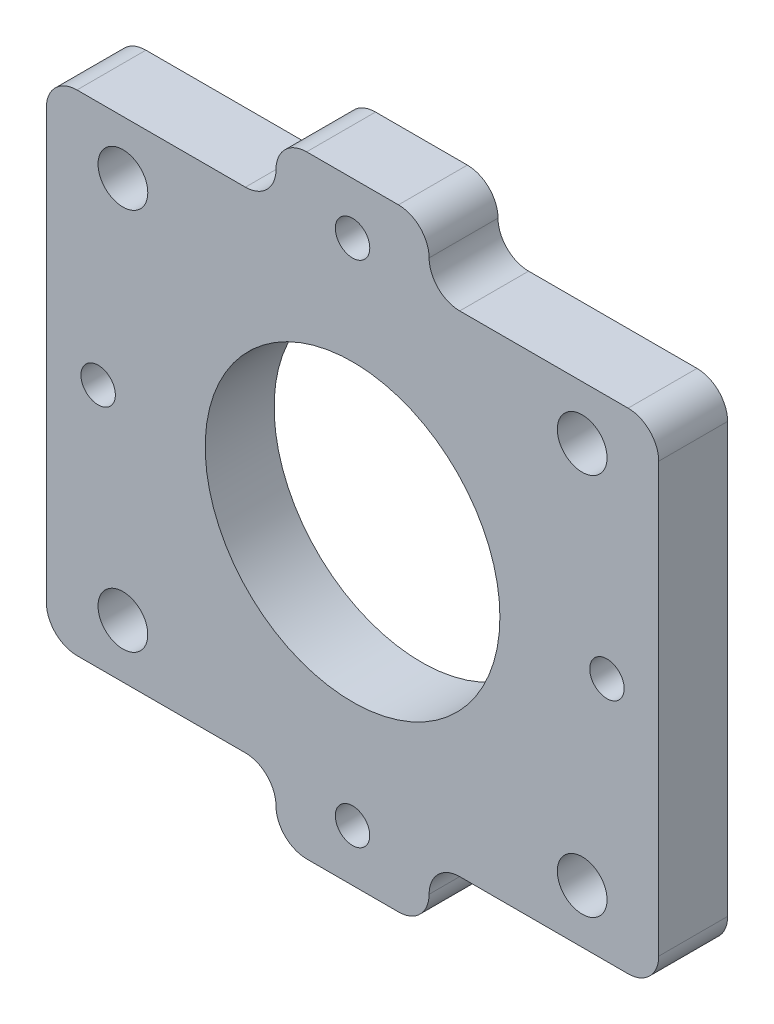
ISO-10303-21;
HEADER;
FILE_DESCRIPTION(('STEP AP214'),'2;1');
FILE_NAME('part.step','',(''),(''),'','','');
FILE_SCHEMA(('AUTOMOTIVE_DESIGN { 1 0 10303 214 1 1 1 1 }'));
ENDSEC;
DATA;
#1=APPLICATION_CONTEXT('core data for automotive mechanical design processes');
#2=APPLICATION_PROTOCOL_DEFINITION('international standard','automotive_design',2000,#1);
#3=PRODUCT_CONTEXT('',#1,'mechanical');
#4=PRODUCT('Part','Part','',(#3));
#5=PRODUCT_RELATED_PRODUCT_CATEGORY('part','',(#4));
#6=PRODUCT_DEFINITION_FORMATION('','',#4);
#7=PRODUCT_DEFINITION_CONTEXT('part definition',#1,'design');
#8=PRODUCT_DEFINITION('design','',#6,#7);
#9=PRODUCT_DEFINITION_SHAPE('','',#8);
#10=(LENGTH_UNIT() NAMED_UNIT(*) SI_UNIT(.MILLI.,.METRE.));
#11=(NAMED_UNIT(*) PLANE_ANGLE_UNIT() SI_UNIT($,.RADIAN.));
#12=(NAMED_UNIT(*) SI_UNIT($,.STERADIAN.) SOLID_ANGLE_UNIT());
#13=UNCERTAINTY_MEASURE_WITH_UNIT(LENGTH_MEASURE(1.E-05),#10,'distance_accuracy_value','');
#14=(GEOMETRIC_REPRESENTATION_CONTEXT(3) GLOBAL_UNCERTAINTY_ASSIGNED_CONTEXT((#13)) GLOBAL_UNIT_ASSIGNED_CONTEXT((#10,
#11,#12)) REPRESENTATION_CONTEXT('',''));
#15=CARTESIAN_POINT('',(0.,0.,0.));
#16=DIRECTION('',(0.,0.,1.));
#17=DIRECTION('',(1.,0.,0.));
#18=AXIS2_PLACEMENT_3D('',#15,#16,#17);
#19=CARTESIAN_POINT('',(0.,0.,9.));
#20=DIRECTION('',(1.,0.,0.));
#21=DIRECTION('',(0.,0.,-1.));
#22=AXIS2_PLACEMENT_3D('',#19,#20,#21);
#23=PLANE('',#22);
#24=DIRECTION('',(0.,-1.,0.));
#25=VECTOR('',#24,1.);
#26=CARTESIAN_POINT('',(0.,0.,0.));
#27=LINE('',#26,#25);
#28=CARTESIAN_POINT('',(0.,68.,0.));
#29=VERTEX_POINT('',#28);
#30=CARTESIAN_POINT('',(0.,12.,0.));
#31=VERTEX_POINT('',#30);
#32=EDGE_CURVE('E313',#29,#31,#27,.T.);
#33=ORIENTED_EDGE('',*,*,#32,.T.);
#34=DIRECTION('',(0.,0.,1.));
#35=VECTOR('',#34,1.);
#36=CARTESIAN_POINT('',(0.,12.,9.));
#37=LINE('',#36,#35);
#38=CARTESIAN_POINT('',(0.,12.,9.));
#39=VERTEX_POINT('',#38);
#40=EDGE_CURVE('E218',#31,#39,#37,.T.);
#41=ORIENTED_EDGE('',*,*,#40,.T.);
#42=DIRECTION('',(0.,-1.,0.));
#43=VECTOR('',#42,1.);
#44=CARTESIAN_POINT('',(0.,0.,9.));
#45=LINE('',#44,#43);
#46=CARTESIAN_POINT('',(0.,68.,9.));
#47=VERTEX_POINT('',#46);
#48=EDGE_CURVE('E303',#47,#39,#45,.T.);
#49=ORIENTED_EDGE('',*,*,#48,.F.);
#50=DIRECTION('',(0.,0.,1.));
#51=VECTOR('',#50,1.);
#52=CARTESIAN_POINT('',(0.,68.,9.));
#53=LINE('',#52,#51);
#54=EDGE_CURVE('E216',#47,#29,#53,.F.);
#55=ORIENTED_EDGE('',*,*,#54,.T.);
#56=EDGE_LOOP('',(#33,#41,#49,#55));
#57=FACE_BOUND('',#56,.T.);
#58=ADVANCED_FACE('F33',(#57),#23,.F.);
#59=CARTESIAN_POINT('',(0.,0.,9.));
#60=DIRECTION('',(0.,1.,0.));
#61=DIRECTION('',(0.,0.,1.));
#62=AXIS2_PLACEMENT_3D('',#59,#60,#61);
#63=PLANE('',#62);
#64=DIRECTION('',(1.,0.,0.));
#65=VECTOR('',#64,1.);
#66=CARTESIAN_POINT('',(0.,0.,9.));
#67=LINE('',#66,#65);
#68=CARTESIAN_POINT('',(34.,0.,9.));
#69=VERTEX_POINT('',#68);
#70=CARTESIAN_POINT('',(46.,0.,9.));
#71=VERTEX_POINT('',#70);
#72=EDGE_CURVE('E306',#69,#71,#67,.T.);
#73=ORIENTED_EDGE('',*,*,#72,.F.);
#74=DIRECTION('',(0.,0.,1.));
#75=VECTOR('',#74,1.);
#76=CARTESIAN_POINT('',(34.,0.,9.));
#77=LINE('',#76,#75);
#78=CARTESIAN_POINT('',(34.,0.,0.));
#79=VERTEX_POINT('',#78);
#80=EDGE_CURVE('E253',#69,#79,#77,.F.);
#81=ORIENTED_EDGE('',*,*,#80,.T.);
#82=DIRECTION('',(1.,0.,0.));
#83=VECTOR('',#82,1.);
#84=CARTESIAN_POINT('',(0.,0.,0.));
#85=LINE('',#84,#83);
#86=CARTESIAN_POINT('',(46.,0.,0.));
#87=VERTEX_POINT('',#86);
#88=EDGE_CURVE('E309',#79,#87,#85,.T.);
#89=ORIENTED_EDGE('',*,*,#88,.T.);
#90=DIRECTION('',(0.,0.,1.));
#91=VECTOR('',#90,1.);
#92=CARTESIAN_POINT('',(46.,0.,9.));
#93=LINE('',#92,#91);
#94=EDGE_CURVE('E251',#87,#71,#93,.T.);
#95=ORIENTED_EDGE('',*,*,#94,.T.);
#96=EDGE_LOOP('',(#73,#81,#89,#95));
#97=FACE_BOUND('',#96,.T.);
#98=ADVANCED_FACE('F414',(#97),#63,.F.);
#99=CARTESIAN_POINT('',(80.,0.,9.));
#100=DIRECTION('',(-1.,0.,0.));
#101=DIRECTION('',(0.,0.,1.));
#102=AXIS2_PLACEMENT_3D('',#99,#100,#101);
#103=PLANE('',#102);
#104=DIRECTION('',(0.,1.,0.));
#105=VECTOR('',#104,1.);
#106=CARTESIAN_POINT('',(80.,0.,9.));
#107=LINE('',#106,#105);
#108=CARTESIAN_POINT('',(80.,12.,9.));
#109=VERTEX_POINT('',#108);
#110=CARTESIAN_POINT('',(80.,68.,9.));
#111=VERTEX_POINT('',#110);
#112=EDGE_CURVE('E318',#109,#111,#107,.T.);
#113=ORIENTED_EDGE('',*,*,#112,.F.);
#114=DIRECTION('',(0.,0.,1.));
#115=VECTOR('',#114,1.);
#116=CARTESIAN_POINT('',(80.,12.,9.));
#117=LINE('',#116,#115);
#118=CARTESIAN_POINT('',(80.,12.,0.));
#119=VERTEX_POINT('',#118);
#120=EDGE_CURVE('E258',#109,#119,#117,.F.);
#121=ORIENTED_EDGE('',*,*,#120,.T.);
#122=DIRECTION('',(0.,1.,0.));
#123=VECTOR('',#122,1.);
#124=CARTESIAN_POINT('',(80.,0.,0.));
#125=LINE('',#124,#123);
#126=CARTESIAN_POINT('',(80.,68.,0.));
#127=VERTEX_POINT('',#126);
#128=EDGE_CURVE('E304',#119,#127,#125,.T.);
#129=ORIENTED_EDGE('',*,*,#128,.T.);
#130=DIRECTION('',(0.,0.,1.));
#131=VECTOR('',#130,1.);
#132=CARTESIAN_POINT('',(80.,68.,9.));
#133=LINE('',#132,#131);
#134=EDGE_CURVE('E255',#127,#111,#133,.T.);
#135=ORIENTED_EDGE('',*,*,#134,.T.);
#136=EDGE_LOOP('',(#113,#121,#129,#135));
#137=FACE_BOUND('',#136,.T.);
#138=ADVANCED_FACE('F435',(#137),#103,.F.);
#139=CARTESIAN_POINT('',(0.,80.,9.));
#140=DIRECTION('',(0.,-1.,0.));
#141=DIRECTION('',(0.,0.,-1.));
#142=AXIS2_PLACEMENT_3D('',#139,#140,#141);
#143=PLANE('',#142);
#144=DIRECTION('',(-1.,0.,0.));
#145=VECTOR('',#144,1.);
#146=CARTESIAN_POINT('',(0.,80.,9.));
#147=LINE('',#146,#145);
#148=CARTESIAN_POINT('',(46.,80.,9.));
#149=VERTEX_POINT('',#148);
#150=CARTESIAN_POINT('',(34.,80.,9.));
#151=VERTEX_POINT('',#150);
#152=EDGE_CURVE('E199',#149,#151,#147,.T.);
#153=ORIENTED_EDGE('',*,*,#152,.F.);
#154=DIRECTION('',(0.,0.,1.));
#155=VECTOR('',#154,1.);
#156=CARTESIAN_POINT('',(46.,80.,9.));
#157=LINE('',#156,#155);
#158=CARTESIAN_POINT('',(46.,80.,0.));
#159=VERTEX_POINT('',#158);
#160=EDGE_CURVE('E262',#149,#159,#157,.F.);
#161=ORIENTED_EDGE('',*,*,#160,.T.);
#162=DIRECTION('',(-1.,0.,0.));
#163=VECTOR('',#162,1.);
#164=CARTESIAN_POINT('',(0.,80.,0.));
#165=LINE('',#164,#163);
#166=CARTESIAN_POINT('',(34.,80.,0.));
#167=VERTEX_POINT('',#166);
#168=EDGE_CURVE('E295',#159,#167,#165,.T.);
#169=ORIENTED_EDGE('',*,*,#168,.T.);
#170=DIRECTION('',(0.,0.,1.));
#171=VECTOR('',#170,1.);
#172=CARTESIAN_POINT('',(34.,80.,9.));
#173=LINE('',#172,#171);
#174=EDGE_CURVE('E260',#167,#151,#173,.T.);
#175=ORIENTED_EDGE('',*,*,#174,.T.);
#176=EDGE_LOOP('',(#153,#161,#169,#175));
#177=FACE_BOUND('',#176,.T.);
#178=ADVANCED_FACE('F300',(#177),#143,.F.);
#179=CARTESIAN_POINT('',(0.,0.,9.));
#180=DIRECTION('',(0.,0.,-1.));
#181=DIRECTION('',(-1.,0.,0.));
#182=AXIS2_PLACEMENT_3D('',#179,#180,#181);
#183=PLANE('',#182);
#184=CARTESIAN_POINT('',(10.0000000000002,14.9999999999999,9.));
#185=DIRECTION('',(0.,0.,1.));
#186=DIRECTION('',(-1.,0.,0.));
#187=AXIS2_PLACEMENT_3D('',#184,#185,#186);
#188=CIRCLE('',#187,3.25);
#189=CARTESIAN_POINT('',(6.75000000000019,14.9999999999999,9.));
#190=VERTEX_POINT('',#189);
#191=EDGE_CURVE('E353',#190,#190,#188,.T.);
#192=ORIENTED_EDGE('',*,*,#191,.F.);
#193=EDGE_LOOP('',(#192));
#194=FACE_BOUND('',#193,.T.);
#195=CARTESIAN_POINT('',(70.0000000000002,15.0000000000003,9.));
#196=DIRECTION('',(0.,0.,1.));
#197=DIRECTION('',(1.,0.,0.));
#198=AXIS2_PLACEMENT_3D('',#195,#196,#197);
#199=CIRCLE('',#198,3.25000000000001);
#200=CARTESIAN_POINT('',(73.2500000000002,15.0000000000003,9.));
#201=VERTEX_POINT('',#200);
#202=EDGE_CURVE('E360',#201,#201,#199,.T.);
#203=ORIENTED_EDGE('',*,*,#202,.F.);
#204=EDGE_LOOP('',(#203));
#205=FACE_BOUND('',#204,.T.);
#206=CARTESIAN_POINT('',(70.,64.9999999999999,9.));
#207=DIRECTION('',(0.,0.,1.));
#208=DIRECTION('',(-1.,0.,0.));
#209=AXIS2_PLACEMENT_3D('',#206,#207,#208);
#210=CIRCLE('',#209,3.25000000000001);
#211=CARTESIAN_POINT('',(66.75,64.9999999999999,9.));
#212=VERTEX_POINT('',#211);
#213=EDGE_CURVE('E366',#212,#212,#210,.T.);
#214=ORIENTED_EDGE('',*,*,#213,.F.);
#215=EDGE_LOOP('',(#214));
#216=FACE_BOUND('',#215,.T.);
#217=CARTESIAN_POINT('',(10.,64.9999999999999,9.));
#218=DIRECTION('',(0.,0.,1.));
#219=DIRECTION('',(1.,0.,0.));
#220=AXIS2_PLACEMENT_3D('',#217,#218,#219);
#221=CIRCLE('',#220,3.25);
#222=CARTESIAN_POINT('',(13.25,64.9999999999999,9.));
#223=VERTEX_POINT('',#222);
#224=EDGE_CURVE('E372',#223,#223,#221,.T.);
#225=ORIENTED_EDGE('',*,*,#224,.F.);
#226=EDGE_LOOP('',(#225));
#227=FACE_BOUND('',#226,.T.);
#228=CARTESIAN_POINT('',(73.2340187157678,40.0000000000001,9.));
#229=DIRECTION('',(0.,0.,1.));
#230=DIRECTION('',(1.,0.,0.));
#231=AXIS2_PLACEMENT_3D('',#228,#229,#230);
#232=CIRCLE('',#231,2.25000000000018);
#233=CARTESIAN_POINT('',(75.4840187157679,40.0000000000001,9.));
#234=VERTEX_POINT('',#233);
#235=EDGE_CURVE('E336',#234,#234,#232,.T.);
#236=ORIENTED_EDGE('',*,*,#235,.F.);
#237=EDGE_LOOP('',(#236));
#238=FACE_BOUND('',#237,.T.);
#239=CARTESIAN_POINT('',(39.9999999999997,73.2340187157675,9.));
#240=DIRECTION('',(0.,0.,1.));
#241=DIRECTION('',(1.,0.,0.));
#242=AXIS2_PLACEMENT_3D('',#239,#240,#241);
#243=CIRCLE('',#242,2.25000000000017);
#244=CARTESIAN_POINT('',(42.2499999999999,73.2340187157675,9.));
#245=VERTEX_POINT('',#244);
#246=EDGE_CURVE('E329',#245,#245,#243,.T.);
#247=ORIENTED_EDGE('',*,*,#246,.F.);
#248=EDGE_LOOP('',(#247));
#249=FACE_BOUND('',#248,.T.);
#250=CARTESIAN_POINT('',(6.76598128423247,39.9999999999994,9.));
#251=DIRECTION('',(0.,0.,1.));
#252=DIRECTION('',(-1.,0.,0.));
#253=AXIS2_PLACEMENT_3D('',#250,#251,#252);
#254=CIRCLE('',#253,2.25);
#255=CARTESIAN_POINT('',(4.51598128423247,39.9999999999994,9.));
#256=VERTEX_POINT('',#255);
#257=EDGE_CURVE('E348',#256,#256,#254,.T.);
#258=ORIENTED_EDGE('',*,*,#257,.F.);
#259=EDGE_LOOP('',(#258));
#260=FACE_BOUND('',#259,.T.);
#261=CARTESIAN_POINT('',(40.0000000000005,6.76598128423199,9.));
#262=DIRECTION('',(0.,0.,1.));
#263=DIRECTION('',(-1.,0.,0.));
#264=AXIS2_PLACEMENT_3D('',#261,#262,#263);
#265=CIRCLE('',#264,2.25);
#266=CARTESIAN_POINT('',(37.7500000000005,6.76598128423199,9.));
#267=VERTEX_POINT('',#266);
#268=EDGE_CURVE('E341',#267,#267,#265,.T.);
#269=ORIENTED_EDGE('',*,*,#268,.F.);
#270=EDGE_LOOP('',(#269));
#271=FACE_BOUND('',#270,.T.);
#272=CARTESIAN_POINT('',(40.,40.,9.));
#273=DIRECTION('',(0.,0.,1.));
#274=DIRECTION('',(1.,0.,0.));
#275=AXIS2_PLACEMENT_3D('',#272,#273,#274);
#276=CIRCLE('',#275,19.25);
#277=CARTESIAN_POINT('',(59.25,40.,9.));
#278=VERTEX_POINT('',#277);
#279=EDGE_CURVE('E323',#278,#278,#276,.T.);
#280=ORIENTED_EDGE('',*,*,#279,.F.);
#281=EDGE_LOOP('',(#280));
#282=FACE_BOUND('',#281,.T.);
#283=ORIENTED_EDGE('',*,*,#48,.T.);
#284=CARTESIAN_POINT('',(4.,12.,9.));
#285=DIRECTION('',(0.,0.,-1.));
#286=DIRECTION('',(-1.,0.,0.));
#287=AXIS2_PLACEMENT_3D('',#284,#285,#286);
#288=CIRCLE('',#287,4.);
#289=CARTESIAN_POINT('',(4.,8.00000000000001,9.));
#290=VERTEX_POINT('',#289);
#291=EDGE_CURVE('E235',#39,#290,#288,.F.);
#292=ORIENTED_EDGE('',*,*,#291,.T.);
#293=DIRECTION('',(1.,0.,0.));
#294=VECTOR('',#293,1.);
#295=CARTESIAN_POINT('',(0.,8.00000000000001,9.));
#296=LINE('',#295,#294);
#297=CARTESIAN_POINT('',(26.,7.99999999999999,9.));
#298=VERTEX_POINT('',#297);
#299=EDGE_CURVE('E385',#290,#298,#296,.T.);
#300=ORIENTED_EDGE('',*,*,#299,.T.);
#301=CARTESIAN_POINT('',(26.,3.99999999999999,9.));
#302=DIRECTION('',(0.,0.,-1.));
#303=DIRECTION('',(-1.,0.,0.));
#304=AXIS2_PLACEMENT_3D('',#301,#302,#303);
#305=CIRCLE('',#304,4.);
#306=CARTESIAN_POINT('',(30.,4.00000000000001,9.));
#307=VERTEX_POINT('',#306);
#308=EDGE_CURVE('E180',#298,#307,#305,.T.);
#309=ORIENTED_EDGE('',*,*,#308,.T.);
#310=CARTESIAN_POINT('',(34.,4.,9.));
#311=DIRECTION('',(0.,0.,-1.));
#312=DIRECTION('',(-1.,0.,0.));
#313=AXIS2_PLACEMENT_3D('',#310,#311,#312);
#314=CIRCLE('',#313,4.);
#315=EDGE_CURVE('E233',#307,#69,#314,.F.);
#316=ORIENTED_EDGE('',*,*,#315,.T.);
#317=ORIENTED_EDGE('',*,*,#72,.T.);
#318=CARTESIAN_POINT('',(46.,4.,9.));
#319=DIRECTION('',(0.,0.,-1.));
#320=DIRECTION('',(-1.,0.,0.));
#321=AXIS2_PLACEMENT_3D('',#318,#319,#320);
#322=CIRCLE('',#321,4.);
#323=CARTESIAN_POINT('',(50.,4.,9.));
#324=VERTEX_POINT('',#323);
#325=EDGE_CURVE('E231',#71,#324,#322,.F.);
#326=ORIENTED_EDGE('',*,*,#325,.T.);
#327=CARTESIAN_POINT('',(54.,4.,9.));
#328=DIRECTION('',(0.,0.,-1.));
#329=DIRECTION('',(-1.,0.,0.));
#330=AXIS2_PLACEMENT_3D('',#327,#328,#329);
#331=CIRCLE('',#330,4.);
#332=CARTESIAN_POINT('',(54.,8.,9.));
#333=VERTEX_POINT('',#332);
#334=EDGE_CURVE('E179',#324,#333,#331,.T.);
#335=ORIENTED_EDGE('',*,*,#334,.T.);
#336=DIRECTION('',(1.,0.,0.));
#337=VECTOR('',#336,1.);
#338=CARTESIAN_POINT('',(0.,7.99999999999995,9.));
#339=LINE('',#338,#337);
#340=CARTESIAN_POINT('',(76.,8.00000000000001,9.));
#341=VERTEX_POINT('',#340);
#342=EDGE_CURVE('E387',#333,#341,#339,.T.);
#343=ORIENTED_EDGE('',*,*,#342,.T.);
#344=CARTESIAN_POINT('',(76.,12.,9.));
#345=DIRECTION('',(0.,0.,-1.));
#346=DIRECTION('',(-1.,0.,0.));
#347=AXIS2_PLACEMENT_3D('',#344,#345,#346);
#348=CIRCLE('',#347,4.);
#349=EDGE_CURVE('E229',#341,#109,#348,.F.);
#350=ORIENTED_EDGE('',*,*,#349,.T.);
#351=ORIENTED_EDGE('',*,*,#112,.T.);
#352=CARTESIAN_POINT('',(76.,68.,9.));
#353=DIRECTION('',(0.,0.,-1.));
#354=DIRECTION('',(-1.,0.,0.));
#355=AXIS2_PLACEMENT_3D('',#352,#353,#354);
#356=CIRCLE('',#355,4.);
#357=CARTESIAN_POINT('',(76.,72.,9.));
#358=VERTEX_POINT('',#357);
#359=EDGE_CURVE('E227',#111,#358,#356,.F.);
#360=ORIENTED_EDGE('',*,*,#359,.T.);
#361=DIRECTION('',(-1.,0.,0.));
#362=VECTOR('',#361,1.);
#363=CARTESIAN_POINT('',(0.,72.,9.));
#364=LINE('',#363,#362);
#365=CARTESIAN_POINT('',(54.,72.,9.));
#366=VERTEX_POINT('',#365);
#367=EDGE_CURVE('E357',#358,#366,#364,.T.);
#368=ORIENTED_EDGE('',*,*,#367,.T.);
#369=CARTESIAN_POINT('',(54.,76.,9.));
#370=DIRECTION('',(0.,0.,-1.));
#371=DIRECTION('',(-1.,0.,0.));
#372=AXIS2_PLACEMENT_3D('',#369,#370,#371);
#373=CIRCLE('',#372,4.);
#374=CARTESIAN_POINT('',(50.,76.,9.));
#375=VERTEX_POINT('',#374);
#376=EDGE_CURVE('E268',#366,#375,#373,.T.);
#377=ORIENTED_EDGE('',*,*,#376,.T.);
#378=CARTESIAN_POINT('',(46.,76.,9.));
#379=DIRECTION('',(0.,0.,-1.));
#380=DIRECTION('',(-1.,0.,0.));
#381=AXIS2_PLACEMENT_3D('',#378,#379,#380);
#382=CIRCLE('',#381,4.);
#383=EDGE_CURVE('E225',#375,#149,#382,.F.);
#384=ORIENTED_EDGE('',*,*,#383,.T.);
#385=ORIENTED_EDGE('',*,*,#152,.T.);
#386=CARTESIAN_POINT('',(34.,76.,9.));
#387=DIRECTION('',(0.,0.,-1.));
#388=DIRECTION('',(-1.,0.,0.));
#389=AXIS2_PLACEMENT_3D('',#386,#387,#388);
#390=CIRCLE('',#389,4.);
#391=CARTESIAN_POINT('',(30.,76.,9.));
#392=VERTEX_POINT('',#391);
#393=EDGE_CURVE('E223',#151,#392,#390,.F.);
#394=ORIENTED_EDGE('',*,*,#393,.T.);
#395=CARTESIAN_POINT('',(26.,76.,9.));
#396=DIRECTION('',(0.,0.,-1.));
#397=DIRECTION('',(-1.,0.,0.));
#398=AXIS2_PLACEMENT_3D('',#395,#396,#397);
#399=CIRCLE('',#398,4.);
#400=CARTESIAN_POINT('',(26.,72.,9.));
#401=VERTEX_POINT('',#400);
#402=EDGE_CURVE('E42',#392,#401,#399,.T.);
#403=ORIENTED_EDGE('',*,*,#402,.T.);
#404=DIRECTION('',(-1.,0.,0.));
#405=VECTOR('',#404,1.);
#406=CARTESIAN_POINT('',(0.,72.,9.));
#407=LINE('',#406,#405);
#408=CARTESIAN_POINT('',(4.,72.,9.));
#409=VERTEX_POINT('',#408);
#410=EDGE_CURVE('E382',#401,#409,#407,.T.);
#411=ORIENTED_EDGE('',*,*,#410,.T.);
#412=CARTESIAN_POINT('',(4.,68.,9.));
#413=DIRECTION('',(0.,0.,-1.));
#414=DIRECTION('',(-1.,0.,0.));
#415=AXIS2_PLACEMENT_3D('',#412,#413,#414);
#416=CIRCLE('',#415,4.);
#417=EDGE_CURVE('E221',#409,#47,#416,.F.);
#418=ORIENTED_EDGE('',*,*,#417,.T.);
#419=EDGE_LOOP('',(#283,#292,#300,#309,#316,#317,#326,#335,#343,#350,#351,#360,#368,#377,#384,
#385,#394,#403,#411,#418));
#420=FACE_BOUND('',#419,.T.);
#421=ADVANCED_FACE('F403',(#194,#205,#216,#227,#238,#249,#260,#271,#282,#420),#183,.F.);
#422=CARTESIAN_POINT('',(0.,0.,0.));
#423=DIRECTION('',(0.,0.,-1.));
#424=DIRECTION('',(-1.,0.,0.));
#425=AXIS2_PLACEMENT_3D('',#422,#423,#424);
#426=PLANE('',#425);
#427=DIRECTION('',(-1.,0.,0.));
#428=VECTOR('',#427,1.);
#429=CARTESIAN_POINT('',(30.,7.99999999999999,0.));
#430=LINE('',#429,#428);
#431=CARTESIAN_POINT('',(26.,7.99999999999999,0.));
#432=VERTEX_POINT('',#431);
#433=CARTESIAN_POINT('',(4.,8.00000000000001,0.));
#434=VERTEX_POINT('',#433);
#435=EDGE_CURVE('E174',#432,#434,#430,.T.);
#436=ORIENTED_EDGE('',*,*,#435,.T.);
#437=CARTESIAN_POINT('',(4.,12.,0.));
#438=DIRECTION('',(0.,0.,-1.));
#439=DIRECTION('',(-1.,0.,0.));
#440=AXIS2_PLACEMENT_3D('',#437,#438,#439);
#441=CIRCLE('',#440,4.);
#442=EDGE_CURVE('E249',#434,#31,#441,.T.);
#443=ORIENTED_EDGE('',*,*,#442,.T.);
#444=ORIENTED_EDGE('',*,*,#32,.F.);
#445=CARTESIAN_POINT('',(4.,68.,0.));
#446=DIRECTION('',(0.,0.,-1.));
#447=DIRECTION('',(-1.,0.,0.));
#448=AXIS2_PLACEMENT_3D('',#445,#446,#447);
#449=CIRCLE('',#448,4.);
#450=CARTESIAN_POINT('',(4.00000000000001,72.,0.));
#451=VERTEX_POINT('',#450);
#452=EDGE_CURVE('E237',#29,#451,#449,.T.);
#453=ORIENTED_EDGE('',*,*,#452,.T.);
#454=DIRECTION('',(1.,0.,0.));
#455=VECTOR('',#454,1.);
#456=CARTESIAN_POINT('',(30.,72.,0.));
#457=LINE('',#456,#455);
#458=CARTESIAN_POINT('',(26.,72.,0.));
#459=VERTEX_POINT('',#458);
#460=EDGE_CURVE('E190',#451,#459,#457,.T.);
#461=ORIENTED_EDGE('',*,*,#460,.T.);
#462=CARTESIAN_POINT('',(26.,76.,0.));
#463=DIRECTION('',(0.,0.,-1.));
#464=DIRECTION('',(-1.,0.,0.));
#465=AXIS2_PLACEMENT_3D('',#462,#463,#464);
#466=CIRCLE('',#465,4.);
#467=CARTESIAN_POINT('',(30.,76.,0.));
#468=VERTEX_POINT('',#467);
#469=EDGE_CURVE('E11',#459,#468,#466,.F.);
#470=ORIENTED_EDGE('',*,*,#469,.T.);
#471=CARTESIAN_POINT('',(34.,76.,0.));
#472=DIRECTION('',(0.,0.,-1.));
#473=DIRECTION('',(-1.,0.,0.));
#474=AXIS2_PLACEMENT_3D('',#471,#472,#473);
#475=CIRCLE('',#474,4.);
#476=EDGE_CURVE('E239',#468,#167,#475,.T.);
#477=ORIENTED_EDGE('',*,*,#476,.T.);
#478=ORIENTED_EDGE('',*,*,#168,.F.);
#479=CARTESIAN_POINT('',(46.,76.,0.));
#480=DIRECTION('',(0.,0.,-1.));
#481=DIRECTION('',(-1.,0.,0.));
#482=AXIS2_PLACEMENT_3D('',#479,#480,#481);
#483=CIRCLE('',#482,4.);
#484=CARTESIAN_POINT('',(50.,76.,0.));
#485=VERTEX_POINT('',#484);
#486=EDGE_CURVE('E241',#159,#485,#483,.T.);
#487=ORIENTED_EDGE('',*,*,#486,.T.);
#488=CARTESIAN_POINT('',(54.,76.,0.));
#489=DIRECTION('',(0.,0.,-1.));
#490=DIRECTION('',(-1.,0.,0.));
#491=AXIS2_PLACEMENT_3D('',#488,#489,#490);
#492=CIRCLE('',#491,4.);
#493=CARTESIAN_POINT('',(54.,72.,0.));
#494=VERTEX_POINT('',#493);
#495=EDGE_CURVE('E270',#485,#494,#492,.F.);
#496=ORIENTED_EDGE('',*,*,#495,.T.);
#497=DIRECTION('',(1.,0.,0.));
#498=VECTOR('',#497,1.);
#499=CARTESIAN_POINT('',(50.,72.,0.));
#500=LINE('',#499,#498);
#501=CARTESIAN_POINT('',(76.,72.,0.));
#502=VERTEX_POINT('',#501);
#503=EDGE_CURVE('E379',#494,#502,#500,.T.);
#504=ORIENTED_EDGE('',*,*,#503,.T.);
#505=CARTESIAN_POINT('',(76.,68.,0.));
#506=DIRECTION('',(0.,0.,-1.));
#507=DIRECTION('',(-1.,0.,0.));
#508=AXIS2_PLACEMENT_3D('',#505,#506,#507);
#509=CIRCLE('',#508,4.);
#510=EDGE_CURVE('E243',#502,#127,#509,.T.);
#511=ORIENTED_EDGE('',*,*,#510,.T.);
#512=ORIENTED_EDGE('',*,*,#128,.F.);
#513=CARTESIAN_POINT('',(76.,12.,0.));
#514=DIRECTION('',(0.,0.,-1.));
#515=DIRECTION('',(-1.,0.,0.));
#516=AXIS2_PLACEMENT_3D('',#513,#514,#515);
#517=CIRCLE('',#516,4.);
#518=CARTESIAN_POINT('',(76.,8.00000000000001,0.));
#519=VERTEX_POINT('',#518);
#520=EDGE_CURVE('E245',#119,#519,#517,.T.);
#521=ORIENTED_EDGE('',*,*,#520,.T.);
#522=DIRECTION('',(-1.,0.,0.));
#523=VECTOR('',#522,1.);
#524=CARTESIAN_POINT('',(50.,7.99999999999999,0.));
#525=LINE('',#524,#523);
#526=CARTESIAN_POINT('',(54.,8.,0.));
#527=VERTEX_POINT('',#526);
#528=EDGE_CURVE('E191',#519,#527,#525,.T.);
#529=ORIENTED_EDGE('',*,*,#528,.T.);
#530=CARTESIAN_POINT('',(54.,4.,0.));
#531=DIRECTION('',(0.,0.,-1.));
#532=DIRECTION('',(-1.,0.,0.));
#533=AXIS2_PLACEMENT_3D('',#530,#531,#532);
#534=CIRCLE('',#533,4.);
#535=CARTESIAN_POINT('',(50.,4.,0.));
#536=VERTEX_POINT('',#535);
#537=EDGE_CURVE('E266',#527,#536,#534,.F.);
#538=ORIENTED_EDGE('',*,*,#537,.T.);
#539=CARTESIAN_POINT('',(46.,4.,0.));
#540=DIRECTION('',(0.,0.,-1.));
#541=DIRECTION('',(-1.,0.,0.));
#542=AXIS2_PLACEMENT_3D('',#539,#540,#541);
#543=CIRCLE('',#542,4.);
#544=EDGE_CURVE('E56',#536,#87,#543,.T.);
#545=ORIENTED_EDGE('',*,*,#544,.T.);
#546=ORIENTED_EDGE('',*,*,#88,.F.);
#547=CARTESIAN_POINT('',(34.,4.,0.));
#548=DIRECTION('',(0.,0.,-1.));
#549=DIRECTION('',(-1.,0.,0.));
#550=AXIS2_PLACEMENT_3D('',#547,#548,#549);
#551=CIRCLE('',#550,4.);
#552=CARTESIAN_POINT('',(30.,4.00000000000001,0.));
#553=VERTEX_POINT('',#552);
#554=EDGE_CURVE('E50',#79,#553,#551,.T.);
#555=ORIENTED_EDGE('',*,*,#554,.T.);
#556=CARTESIAN_POINT('',(26.,3.99999999999999,0.));
#557=DIRECTION('',(0.,0.,-1.));
#558=DIRECTION('',(-1.,0.,0.));
#559=AXIS2_PLACEMENT_3D('',#556,#557,#558);
#560=CIRCLE('',#559,4.);
#561=EDGE_CURVE('E170',#553,#432,#560,.F.);
#562=ORIENTED_EDGE('',*,*,#561,.T.);
#563=EDGE_LOOP('',(#436,#443,#444,#453,#461,#470,#477,#478,#487,#496,#504,#511,#512,#521,#529,
#538,#545,#546,#555,#562));
#564=FACE_BOUND('',#563,.T.);
#565=CARTESIAN_POINT('',(10.0000000000002,14.9999999999999,0.));
#566=DIRECTION('',(0.,0.,1.));
#567=DIRECTION('',(-1.,0.,0.));
#568=AXIS2_PLACEMENT_3D('',#565,#566,#567);
#569=CIRCLE('',#568,3.25);
#570=CARTESIAN_POINT('',(6.75000000000019,14.9999999999999,0.));
#571=VERTEX_POINT('',#570);
#572=EDGE_CURVE('E356',#571,#571,#569,.T.);
#573=ORIENTED_EDGE('',*,*,#572,.T.);
#574=EDGE_LOOP('',(#573));
#575=FACE_BOUND('',#574,.T.);
#576=CARTESIAN_POINT('',(70.0000000000002,15.0000000000003,0.));
#577=DIRECTION('',(0.,0.,1.));
#578=DIRECTION('',(1.,0.,0.));
#579=AXIS2_PLACEMENT_3D('',#576,#577,#578);
#580=CIRCLE('',#579,3.25000000000001);
#581=CARTESIAN_POINT('',(73.2500000000002,15.0000000000003,0.));
#582=VERTEX_POINT('',#581);
#583=EDGE_CURVE('E363',#582,#582,#580,.T.);
#584=ORIENTED_EDGE('',*,*,#583,.T.);
#585=EDGE_LOOP('',(#584));
#586=FACE_BOUND('',#585,.T.);
#587=CARTESIAN_POINT('',(70.,64.9999999999999,0.));
#588=DIRECTION('',(0.,0.,1.));
#589=DIRECTION('',(-1.,0.,0.));
#590=AXIS2_PLACEMENT_3D('',#587,#588,#589);
#591=CIRCLE('',#590,3.25000000000001);
#592=CARTESIAN_POINT('',(66.75,64.9999999999999,0.));
#593=VERTEX_POINT('',#592);
#594=EDGE_CURVE('E369',#593,#593,#591,.T.);
#595=ORIENTED_EDGE('',*,*,#594,.T.);
#596=EDGE_LOOP('',(#595));
#597=FACE_BOUND('',#596,.T.);
#598=CARTESIAN_POINT('',(10.,64.9999999999999,0.));
#599=DIRECTION('',(0.,0.,1.));
#600=DIRECTION('',(1.,0.,0.));
#601=AXIS2_PLACEMENT_3D('',#598,#599,#600);
#602=CIRCLE('',#601,3.25);
#603=CARTESIAN_POINT('',(13.25,64.9999999999999,0.));
#604=VERTEX_POINT('',#603);
#605=EDGE_CURVE('E345',#604,#604,#602,.T.);
#606=ORIENTED_EDGE('',*,*,#605,.T.);
#607=EDGE_LOOP('',(#606));
#608=FACE_BOUND('',#607,.T.);
#609=CARTESIAN_POINT('',(73.2340187157678,40.0000000000001,0.));
#610=DIRECTION('',(0.,0.,1.));
#611=DIRECTION('',(1.,0.,0.));
#612=AXIS2_PLACEMENT_3D('',#609,#610,#611);
#613=CIRCLE('',#612,2.25000000000018);
#614=CARTESIAN_POINT('',(75.4840187157679,40.0000000000001,0.));
#615=VERTEX_POINT('',#614);
#616=EDGE_CURVE('E326',#615,#615,#613,.T.);
#617=ORIENTED_EDGE('',*,*,#616,.T.);
#618=EDGE_LOOP('',(#617));
#619=FACE_BOUND('',#618,.T.);
#620=CARTESIAN_POINT('',(39.9999999999997,73.2340187157675,0.));
#621=DIRECTION('',(0.,0.,1.));
#622=DIRECTION('',(1.,0.,0.));
#623=AXIS2_PLACEMENT_3D('',#620,#621,#622);
#624=CIRCLE('',#623,2.25000000000017);
#625=CARTESIAN_POINT('',(42.2499999999999,73.2340187157675,0.));
#626=VERTEX_POINT('',#625);
#627=EDGE_CURVE('E332',#626,#626,#624,.T.);
#628=ORIENTED_EDGE('',*,*,#627,.T.);
#629=EDGE_LOOP('',(#628));
#630=FACE_BOUND('',#629,.T.);
#631=CARTESIAN_POINT('',(6.76598128423247,39.9999999999994,0.));
#632=DIRECTION('',(0.,0.,1.));
#633=DIRECTION('',(-1.,0.,0.));
#634=AXIS2_PLACEMENT_3D('',#631,#632,#633);
#635=CIRCLE('',#634,2.25);
#636=CARTESIAN_POINT('',(4.51598128423247,39.9999999999994,0.));
#637=VERTEX_POINT('',#636);
#638=EDGE_CURVE('E333',#637,#637,#635,.T.);
#639=ORIENTED_EDGE('',*,*,#638,.T.);
#640=EDGE_LOOP('',(#639));
#641=FACE_BOUND('',#640,.T.);
#642=CARTESIAN_POINT('',(40.0000000000005,6.76598128423199,0.));
#643=DIRECTION('',(0.,0.,1.));
#644=DIRECTION('',(-1.,0.,0.));
#645=AXIS2_PLACEMENT_3D('',#642,#643,#644);
#646=CIRCLE('',#645,2.25);
#647=CARTESIAN_POINT('',(37.7500000000005,6.76598128423199,0.));
#648=VERTEX_POINT('',#647);
#649=EDGE_CURVE('E344',#648,#648,#646,.T.);
#650=ORIENTED_EDGE('',*,*,#649,.T.);
#651=EDGE_LOOP('',(#650));
#652=FACE_BOUND('',#651,.T.);
#653=CARTESIAN_POINT('',(40.,40.,0.));
#654=DIRECTION('',(0.,0.,1.));
#655=DIRECTION('',(1.,0.,0.));
#656=AXIS2_PLACEMENT_3D('',#653,#654,#655);
#657=CIRCLE('',#656,19.25);
#658=CARTESIAN_POINT('',(59.25,40.,0.));
#659=VERTEX_POINT('',#658);
#660=EDGE_CURVE('E316',#659,#659,#657,.T.);
#661=ORIENTED_EDGE('',*,*,#660,.T.);
#662=EDGE_LOOP('',(#661));
#663=FACE_BOUND('',#662,.T.);
#664=ADVANCED_FACE('F172',(#564,#575,#586,#597,#608,#619,#630,#641,#652,#663),#426,.T.);
#665=CARTESIAN_POINT('',(40.,40.,0.));
#666=DIRECTION('',(0.,0.,1.));
#667=DIRECTION('',(1.,0.,0.));
#668=AXIS2_PLACEMENT_3D('',#665,#666,#667);
#669=CYLINDRICAL_SURFACE('',#668,19.25);
#670=ORIENTED_EDGE('',*,*,#660,.F.);
#671=EDGE_LOOP('',(#670));
#672=FACE_BOUND('',#671,.T.);
#673=ORIENTED_EDGE('',*,*,#279,.T.);
#674=EDGE_LOOP('',(#673));
#675=FACE_BOUND('',#674,.T.);
#676=ADVANCED_FACE('F650',(#672,#675),#669,.F.);
#677=CARTESIAN_POINT('',(40.0000000000005,6.76598128423199,0.));
#678=DIRECTION('',(0.,0.,1.));
#679=DIRECTION('',(1.,0.,0.));
#680=AXIS2_PLACEMENT_3D('',#677,#678,#679);
#681=CYLINDRICAL_SURFACE('',#680,2.25);
#682=ORIENTED_EDGE('',*,*,#649,.F.);
#683=EDGE_LOOP('',(#682));
#684=FACE_BOUND('',#683,.T.);
#685=ORIENTED_EDGE('',*,*,#268,.T.);
#686=EDGE_LOOP('',(#685));
#687=FACE_BOUND('',#686,.T.);
#688=ADVANCED_FACE('F641',(#684,#687),#681,.F.);
#689=CARTESIAN_POINT('',(6.76598128423247,39.9999999999994,0.));
#690=DIRECTION('',(0.,0.,1.));
#691=DIRECTION('',(1.,0.,0.));
#692=AXIS2_PLACEMENT_3D('',#689,#690,#691);
#693=CYLINDRICAL_SURFACE('',#692,2.25);
#694=ORIENTED_EDGE('',*,*,#638,.F.);
#695=EDGE_LOOP('',(#694));
#696=FACE_BOUND('',#695,.T.);
#697=ORIENTED_EDGE('',*,*,#257,.T.);
#698=EDGE_LOOP('',(#697));
#699=FACE_BOUND('',#698,.T.);
#700=ADVANCED_FACE('F632',(#696,#699),#693,.F.);
#701=CARTESIAN_POINT('',(39.9999999999997,73.2340187157675,0.));
#702=DIRECTION('',(0.,0.,1.));
#703=DIRECTION('',(1.,0.,0.));
#704=AXIS2_PLACEMENT_3D('',#701,#702,#703);
#705=CYLINDRICAL_SURFACE('',#704,2.25000000000017);
#706=ORIENTED_EDGE('',*,*,#627,.F.);
#707=EDGE_LOOP('',(#706));
#708=FACE_BOUND('',#707,.T.);
#709=ORIENTED_EDGE('',*,*,#246,.T.);
#710=EDGE_LOOP('',(#709));
#711=FACE_BOUND('',#710,.T.);
#712=ADVANCED_FACE('F623',(#708,#711),#705,.F.);
#713=CARTESIAN_POINT('',(73.2340187157678,40.0000000000001,0.));
#714=DIRECTION('',(0.,0.,1.));
#715=DIRECTION('',(1.,0.,0.));
#716=AXIS2_PLACEMENT_3D('',#713,#714,#715);
#717=CYLINDRICAL_SURFACE('',#716,2.25000000000018);
#718=ORIENTED_EDGE('',*,*,#616,.F.);
#719=EDGE_LOOP('',(#718));
#720=FACE_BOUND('',#719,.T.);
#721=ORIENTED_EDGE('',*,*,#235,.T.);
#722=EDGE_LOOP('',(#721));
#723=FACE_BOUND('',#722,.T.);
#724=ADVANCED_FACE('F614',(#720,#723),#717,.F.);
#725=CARTESIAN_POINT('',(10.,64.9999999999999,0.));
#726=DIRECTION('',(0.,0.,1.));
#727=DIRECTION('',(1.,0.,0.));
#728=AXIS2_PLACEMENT_3D('',#725,#726,#727);
#729=CYLINDRICAL_SURFACE('',#728,3.25);
#730=ORIENTED_EDGE('',*,*,#605,.F.);
#731=EDGE_LOOP('',(#730));
#732=FACE_BOUND('',#731,.T.);
#733=ORIENTED_EDGE('',*,*,#224,.T.);
#734=EDGE_LOOP('',(#733));
#735=FACE_BOUND('',#734,.T.);
#736=ADVANCED_FACE('F605',(#732,#735),#729,.F.);
#737=CARTESIAN_POINT('',(70.,64.9999999999999,0.));
#738=DIRECTION('',(0.,0.,1.));
#739=DIRECTION('',(1.,0.,0.));
#740=AXIS2_PLACEMENT_3D('',#737,#738,#739);
#741=CYLINDRICAL_SURFACE('',#740,3.25000000000001);
#742=ORIENTED_EDGE('',*,*,#594,.F.);
#743=EDGE_LOOP('',(#742));
#744=FACE_BOUND('',#743,.T.);
#745=ORIENTED_EDGE('',*,*,#213,.T.);
#746=EDGE_LOOP('',(#745));
#747=FACE_BOUND('',#746,.T.);
#748=ADVANCED_FACE('F596',(#744,#747),#741,.F.);
#749=CARTESIAN_POINT('',(70.0000000000002,15.0000000000003,0.));
#750=DIRECTION('',(0.,0.,1.));
#751=DIRECTION('',(1.,0.,0.));
#752=AXIS2_PLACEMENT_3D('',#749,#750,#751);
#753=CYLINDRICAL_SURFACE('',#752,3.25000000000001);
#754=ORIENTED_EDGE('',*,*,#583,.F.);
#755=EDGE_LOOP('',(#754));
#756=FACE_BOUND('',#755,.T.);
#757=ORIENTED_EDGE('',*,*,#202,.T.);
#758=EDGE_LOOP('',(#757));
#759=FACE_BOUND('',#758,.T.);
#760=ADVANCED_FACE('F587',(#756,#759),#753,.F.);
#761=CARTESIAN_POINT('',(10.0000000000002,14.9999999999999,0.));
#762=DIRECTION('',(0.,0.,1.));
#763=DIRECTION('',(1.,0.,0.));
#764=AXIS2_PLACEMENT_3D('',#761,#762,#763);
#765=CYLINDRICAL_SURFACE('',#764,3.25);
#766=ORIENTED_EDGE('',*,*,#572,.F.);
#767=EDGE_LOOP('',(#766));
#768=FACE_BOUND('',#767,.T.);
#769=ORIENTED_EDGE('',*,*,#191,.T.);
#770=EDGE_LOOP('',(#769));
#771=FACE_BOUND('',#770,.T.);
#772=ADVANCED_FACE('F578',(#768,#771),#765,.F.);
#773=CARTESIAN_POINT('',(50.,72.,0.));
#774=DIRECTION('',(0.,-1.,0.));
#775=DIRECTION('',(0.,0.,-1.));
#776=AXIS2_PLACEMENT_3D('',#773,#774,#775);
#777=PLANE('',#776);
#778=ORIENTED_EDGE('',*,*,#503,.F.);
#779=DIRECTION('',(0.,0.,1.));
#780=VECTOR('',#779,1.);
#781=CARTESIAN_POINT('',(54.,72.,9.));
#782=LINE('',#781,#780);
#783=EDGE_CURVE('E207',#494,#366,#782,.T.);
#784=ORIENTED_EDGE('',*,*,#783,.T.);
#785=ORIENTED_EDGE('',*,*,#367,.F.);
#786=DIRECTION('',(0.,0.,1.));
#787=VECTOR('',#786,1.);
#788=CARTESIAN_POINT('',(76.,72.,0.));
#789=LINE('',#788,#787);
#790=EDGE_CURVE('E205',#358,#502,#789,.F.);
#791=ORIENTED_EDGE('',*,*,#790,.T.);
#792=EDGE_LOOP('',(#778,#784,#785,#791));
#793=FACE_BOUND('',#792,.T.);
#794=ADVANCED_FACE('F445',(#793),#777,.F.);
#795=CARTESIAN_POINT('',(50.,7.99999999999999,0.));
#796=DIRECTION('',(0.,1.,0.));
#797=DIRECTION('',(-1.,0.,0.));
#798=AXIS2_PLACEMENT_3D('',#795,#796,#797);
#799=PLANE('',#798);
#800=ORIENTED_EDGE('',*,*,#342,.F.);
#801=DIRECTION('',(0.,0.,1.));
#802=VECTOR('',#801,1.);
#803=CARTESIAN_POINT('',(54.,8.,0.));
#804=LINE('',#803,#802);
#805=EDGE_CURVE('E197',#333,#527,#804,.F.);
#806=ORIENTED_EDGE('',*,*,#805,.T.);
#807=ORIENTED_EDGE('',*,*,#528,.F.);
#808=DIRECTION('',(0.,0.,1.));
#809=VECTOR('',#808,1.);
#810=CARTESIAN_POINT('',(76.,8.00000000000001,0.));
#811=LINE('',#810,#809);
#812=EDGE_CURVE('E194',#519,#341,#811,.T.);
#813=ORIENTED_EDGE('',*,*,#812,.T.);
#814=EDGE_LOOP('',(#800,#806,#807,#813));
#815=FACE_BOUND('',#814,.T.);
#816=ADVANCED_FACE('F426',(#815),#799,.F.);
#817=CARTESIAN_POINT('',(30.,7.99999999999999,0.));
#818=DIRECTION('',(0.,1.,0.));
#819=DIRECTION('',(-1.,0.,0.));
#820=AXIS2_PLACEMENT_3D('',#817,#818,#819);
#821=PLANE('',#820);
#822=ORIENTED_EDGE('',*,*,#435,.F.);
#823=DIRECTION('',(0.,0.,1.));
#824=VECTOR('',#823,1.);
#825=CARTESIAN_POINT('',(26.,7.99999999999999,9.));
#826=LINE('',#825,#824);
#827=EDGE_CURVE('E186',#432,#298,#826,.T.);
#828=ORIENTED_EDGE('',*,*,#827,.T.);
#829=ORIENTED_EDGE('',*,*,#299,.F.);
#830=DIRECTION('',(0.,0.,1.));
#831=VECTOR('',#830,1.);
#832=CARTESIAN_POINT('',(4.,8.00000000000001,0.));
#833=LINE('',#832,#831);
#834=EDGE_CURVE('E189',#290,#434,#833,.F.);
#835=ORIENTED_EDGE('',*,*,#834,.T.);
#836=EDGE_LOOP('',(#822,#828,#829,#835));
#837=FACE_BOUND('',#836,.T.);
#838=ADVANCED_FACE('F184',(#837),#821,.F.);
#839=CARTESIAN_POINT('',(30.,72.,0.));
#840=DIRECTION('',(0.,-1.,0.));
#841=DIRECTION('',(1.,0.,0.));
#842=AXIS2_PLACEMENT_3D('',#839,#840,#841);
#843=PLANE('',#842);
#844=ORIENTED_EDGE('',*,*,#410,.F.);
#845=DIRECTION('',(0.,0.,1.));
#846=VECTOR('',#845,1.);
#847=CARTESIAN_POINT('',(26.,72.,0.));
#848=LINE('',#847,#846);
#849=EDGE_CURVE('E213',#401,#459,#848,.F.);
#850=ORIENTED_EDGE('',*,*,#849,.T.);
#851=ORIENTED_EDGE('',*,*,#460,.F.);
#852=DIRECTION('',(0.,0.,1.));
#853=VECTOR('',#852,1.);
#854=CARTESIAN_POINT('',(4.,72.,0.));
#855=LINE('',#854,#853);
#856=EDGE_CURVE('E210',#451,#409,#855,.T.);
#857=ORIENTED_EDGE('',*,*,#856,.T.);
#858=EDGE_LOOP('',(#844,#850,#851,#857));
#859=FACE_BOUND('',#858,.T.);
#860=ADVANCED_FACE('F398',(#859),#843,.F.);
#861=CARTESIAN_POINT('',(34.,4.,0.));
#862=DIRECTION('',(0.,0.,1.));
#863=DIRECTION('',(1.,0.,0.));
#864=AXIS2_PLACEMENT_3D('',#861,#862,#863);
#865=CYLINDRICAL_SURFACE('',#864,4.);
#866=DIRECTION('',(0.,0.,1.));
#867=VECTOR('',#866,1.);
#868=CARTESIAN_POINT('',(30.,4.00000000000001,0.));
#869=LINE('',#868,#867);
#870=EDGE_CURVE('E273',#553,#307,#869,.T.);
#871=ORIENTED_EDGE('',*,*,#870,.F.);
#872=ORIENTED_EDGE('',*,*,#554,.F.);
#873=ORIENTED_EDGE('',*,*,#80,.F.);
#874=ORIENTED_EDGE('',*,*,#315,.F.);
#875=EDGE_LOOP('',(#871,#872,#873,#874));
#876=FACE_BOUND('',#875,.T.);
#877=ADVANCED_FACE('F412',(#876),#865,.T.);
#878=CARTESIAN_POINT('',(26.,3.99999999999999,0.));
#879=DIRECTION('',(0.,0.,-1.));
#880=DIRECTION('',(-1.,0.,0.));
#881=AXIS2_PLACEMENT_3D('',#878,#879,#880);
#882=CYLINDRICAL_SURFACE('',#881,4.);
#883=ORIENTED_EDGE('',*,*,#561,.F.);
#884=ORIENTED_EDGE('',*,*,#870,.T.);
#885=ORIENTED_EDGE('',*,*,#308,.F.);
#886=ORIENTED_EDGE('',*,*,#827,.F.);
#887=EDGE_LOOP('',(#883,#884,#885,#886));
#888=FACE_BOUND('',#887,.T.);
#889=ADVANCED_FACE('F193',(#888),#882,.F.);
#890=CARTESIAN_POINT('',(46.,4.,9.));
#891=DIRECTION('',(0.,0.,1.));
#892=DIRECTION('',(1.,0.,0.));
#893=AXIS2_PLACEMENT_3D('',#890,#891,#892);
#894=CYLINDRICAL_SURFACE('',#893,4.);
#895=ORIENTED_EDGE('',*,*,#94,.F.);
#896=ORIENTED_EDGE('',*,*,#544,.F.);
#897=DIRECTION('',(0.,0.,1.));
#898=VECTOR('',#897,1.);
#899=CARTESIAN_POINT('',(50.,4.,0.));
#900=LINE('',#899,#898);
#901=EDGE_CURVE('E275',#324,#536,#900,.F.);
#902=ORIENTED_EDGE('',*,*,#901,.F.);
#903=ORIENTED_EDGE('',*,*,#325,.F.);
#904=EDGE_LOOP('',(#895,#896,#902,#903));
#905=FACE_BOUND('',#904,.T.);
#906=ADVANCED_FACE('F419',(#905),#894,.T.);
#907=CARTESIAN_POINT('',(54.,4.,0.));
#908=DIRECTION('',(0.,0.,-1.));
#909=DIRECTION('',(-1.,0.,0.));
#910=AXIS2_PLACEMENT_3D('',#907,#908,#909);
#911=CYLINDRICAL_SURFACE('',#910,4.);
#912=ORIENTED_EDGE('',*,*,#537,.F.);
#913=ORIENTED_EDGE('',*,*,#805,.F.);
#914=ORIENTED_EDGE('',*,*,#334,.F.);
#915=ORIENTED_EDGE('',*,*,#901,.T.);
#916=EDGE_LOOP('',(#912,#913,#914,#915));
#917=FACE_BOUND('',#916,.T.);
#918=ADVANCED_FACE('F423',(#917),#911,.F.);
#919=CARTESIAN_POINT('',(46.,76.,0.));
#920=DIRECTION('',(0.,0.,1.));
#921=DIRECTION('',(1.,0.,0.));
#922=AXIS2_PLACEMENT_3D('',#919,#920,#921);
#923=CYLINDRICAL_SURFACE('',#922,4.);
#924=DIRECTION('',(0.,0.,1.));
#925=VECTOR('',#924,1.);
#926=CARTESIAN_POINT('',(50.,76.,0.));
#927=LINE('',#926,#925);
#928=EDGE_CURVE('E277',#485,#375,#927,.T.);
#929=ORIENTED_EDGE('',*,*,#928,.F.);
#930=ORIENTED_EDGE('',*,*,#486,.F.);
#931=ORIENTED_EDGE('',*,*,#160,.F.);
#932=ORIENTED_EDGE('',*,*,#383,.F.);
#933=EDGE_LOOP('',(#929,#930,#931,#932));
#934=FACE_BOUND('',#933,.T.);
#935=ADVANCED_FACE('F450',(#934),#923,.T.);
#936=CARTESIAN_POINT('',(54.,76.,0.));
#937=DIRECTION('',(0.,0.,-1.));
#938=DIRECTION('',(-1.,0.,0.));
#939=AXIS2_PLACEMENT_3D('',#936,#937,#938);
#940=CYLINDRICAL_SURFACE('',#939,4.);
#941=ORIENTED_EDGE('',*,*,#495,.F.);
#942=ORIENTED_EDGE('',*,*,#928,.T.);
#943=ORIENTED_EDGE('',*,*,#376,.F.);
#944=ORIENTED_EDGE('',*,*,#783,.F.);
#945=EDGE_LOOP('',(#941,#942,#943,#944));
#946=FACE_BOUND('',#945,.T.);
#947=ADVANCED_FACE('F447',(#946),#940,.F.);
#948=CARTESIAN_POINT('',(34.,76.,9.));
#949=DIRECTION('',(0.,0.,1.));
#950=DIRECTION('',(1.,0.,0.));
#951=AXIS2_PLACEMENT_3D('',#948,#949,#950);
#952=CYLINDRICAL_SURFACE('',#951,4.);
#953=ORIENTED_EDGE('',*,*,#174,.F.);
#954=ORIENTED_EDGE('',*,*,#476,.F.);
#955=DIRECTION('',(0.,0.,1.));
#956=VECTOR('',#955,1.);
#957=CARTESIAN_POINT('',(30.,76.,0.));
#958=LINE('',#957,#956);
#959=EDGE_CURVE('E37',#392,#468,#958,.F.);
#960=ORIENTED_EDGE('',*,*,#959,.F.);
#961=ORIENTED_EDGE('',*,*,#393,.F.);
#962=EDGE_LOOP('',(#953,#954,#960,#961));
#963=FACE_BOUND('',#962,.T.);
#964=ADVANCED_FACE('F292',(#963),#952,.T.);
#965=CARTESIAN_POINT('',(26.,76.,0.));
#966=DIRECTION('',(0.,0.,-1.));
#967=DIRECTION('',(-1.,0.,0.));
#968=AXIS2_PLACEMENT_3D('',#965,#966,#967);
#969=CYLINDRICAL_SURFACE('',#968,4.);
#970=ORIENTED_EDGE('',*,*,#469,.F.);
#971=ORIENTED_EDGE('',*,*,#849,.F.);
#972=ORIENTED_EDGE('',*,*,#402,.F.);
#973=ORIENTED_EDGE('',*,*,#959,.T.);
#974=EDGE_LOOP('',(#970,#971,#972,#973));
#975=FACE_BOUND('',#974,.T.);
#976=ADVANCED_FACE('F286',(#975),#969,.F.);
#977=CARTESIAN_POINT('',(4.,12.,9.));
#978=DIRECTION('',(0.,0.,1.));
#979=DIRECTION('',(1.,0.,0.));
#980=AXIS2_PLACEMENT_3D('',#977,#978,#979);
#981=CYLINDRICAL_SURFACE('',#980,4.);
#982=ORIENTED_EDGE('',*,*,#442,.F.);
#983=ORIENTED_EDGE('',*,*,#834,.F.);
#984=ORIENTED_EDGE('',*,*,#291,.F.);
#985=ORIENTED_EDGE('',*,*,#40,.F.);
#986=EDGE_LOOP('',(#982,#983,#984,#985));
#987=FACE_BOUND('',#986,.T.);
#988=ADVANCED_FACE('F407',(#987),#981,.T.);
#989=CARTESIAN_POINT('',(76.,12.,0.));
#990=DIRECTION('',(0.,0.,1.));
#991=DIRECTION('',(1.,0.,0.));
#992=AXIS2_PLACEMENT_3D('',#989,#990,#991);
#993=CYLINDRICAL_SURFACE('',#992,4.);
#994=ORIENTED_EDGE('',*,*,#520,.F.);
#995=ORIENTED_EDGE('',*,*,#120,.F.);
#996=ORIENTED_EDGE('',*,*,#349,.F.);
#997=ORIENTED_EDGE('',*,*,#812,.F.);
#998=EDGE_LOOP('',(#994,#995,#996,#997));
#999=FACE_BOUND('',#998,.T.);
#1000=ADVANCED_FACE('F431',(#999),#993,.T.);
#1001=CARTESIAN_POINT('',(76.,68.,9.));
#1002=DIRECTION('',(0.,0.,1.));
#1003=DIRECTION('',(1.,0.,0.));
#1004=AXIS2_PLACEMENT_3D('',#1001,#1002,#1003);
#1005=CYLINDRICAL_SURFACE('',#1004,4.);
#1006=ORIENTED_EDGE('',*,*,#510,.F.);
#1007=ORIENTED_EDGE('',*,*,#790,.F.);
#1008=ORIENTED_EDGE('',*,*,#359,.F.);
#1009=ORIENTED_EDGE('',*,*,#134,.F.);
#1010=EDGE_LOOP('',(#1006,#1007,#1008,#1009));
#1011=FACE_BOUND('',#1010,.T.);
#1012=ADVANCED_FACE('F440',(#1011),#1005,.T.);
#1013=CARTESIAN_POINT('',(4.,68.,0.));
#1014=DIRECTION('',(0.,0.,1.));
#1015=DIRECTION('',(1.,0.,0.));
#1016=AXIS2_PLACEMENT_3D('',#1013,#1014,#1015);
#1017=CYLINDRICAL_SURFACE('',#1016,4.);
#1018=ORIENTED_EDGE('',*,*,#452,.F.);
#1019=ORIENTED_EDGE('',*,*,#54,.F.);
#1020=ORIENTED_EDGE('',*,*,#417,.F.);
#1021=ORIENTED_EDGE('',*,*,#856,.F.);
#1022=EDGE_LOOP('',(#1018,#1019,#1020,#1021));
#1023=FACE_BOUND('',#1022,.T.);
#1024=ADVANCED_FACE('F35',(#1023),#1017,.T.);
#1025=CLOSED_SHELL('',(#58,#98,#138,#178,#421,#664,#676,#688,#700,#712,#724,#736,#748,#760,#772,
#794,#816,#838,#860,#877,#889,#906,#918,#935,#947,#964,#976,#988,#1000,#1012,#1024));
#1026=MANIFOLD_SOLID_BREP('B2',#1025);
#1027=ADVANCED_BREP_SHAPE_REPRESENTATION('',(#18,#1026),#14);
#1028=SHAPE_DEFINITION_REPRESENTATION(#9,#1027);
ENDSEC;
END-ISO-10303-21;
